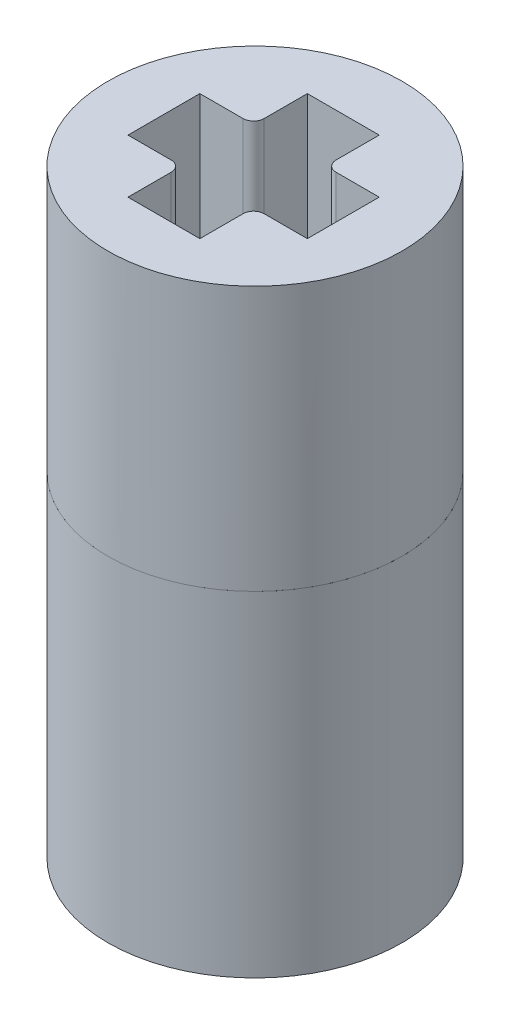
ISO-10303-21;
HEADER;
FILE_DESCRIPTION(('STEP AP214'),'2;1');
FILE_NAME('part.step','',(''),(''),'','','');
FILE_SCHEMA(('AUTOMOTIVE_DESIGN { 1 0 10303 214 1 1 1 1 }'));
ENDSEC;
DATA;
#1=APPLICATION_CONTEXT('core data for automotive mechanical design processes');
#2=APPLICATION_PROTOCOL_DEFINITION('international standard','automotive_design',2000,#1);
#3=PRODUCT_CONTEXT('',#1,'mechanical');
#4=PRODUCT('Part','Part','',(#3));
#5=PRODUCT_RELATED_PRODUCT_CATEGORY('part','',(#4));
#6=PRODUCT_DEFINITION_FORMATION('','',#4);
#7=PRODUCT_DEFINITION_CONTEXT('part definition',#1,'design');
#8=PRODUCT_DEFINITION('design','',#6,#7);
#9=PRODUCT_DEFINITION_SHAPE('','',#8);
#10=(LENGTH_UNIT() NAMED_UNIT(*) SI_UNIT(.MILLI.,.METRE.));
#11=(NAMED_UNIT(*) PLANE_ANGLE_UNIT() SI_UNIT($,.RADIAN.));
#12=(NAMED_UNIT(*) SI_UNIT($,.STERADIAN.) SOLID_ANGLE_UNIT());
#13=UNCERTAINTY_MEASURE_WITH_UNIT(LENGTH_MEASURE(1.E-05),#10,'distance_accuracy_value','');
#14=(GEOMETRIC_REPRESENTATION_CONTEXT(3) GLOBAL_UNCERTAINTY_ASSIGNED_CONTEXT((#13)) GLOBAL_UNIT_ASSIGNED_CONTEXT((#10,
#11,#12)) REPRESENTATION_CONTEXT('',''));
#15=CARTESIAN_POINT('',(0.,0.,0.));
#16=DIRECTION('',(0.,0.,1.));
#17=DIRECTION('',(1.,0.,0.));
#18=AXIS2_PLACEMENT_3D('',#15,#16,#17);
#19=CARTESIAN_POINT('',(1.45920248715791,15.1286633600111,10.1977462085435));
#20=DIRECTION('',(0.,0.,1.));
#21=DIRECTION('',(1.,0.,0.));
#22=AXIS2_PLACEMENT_3D('',#19,#20,#21);
#23=PLANE('',#22);
#24=DIRECTION('',(0.,1.,0.));
#25=VECTOR('',#24,1.);
#26=CARTESIAN_POINT('',(2.98420248715791,7.6286633600111,10.1977462085435));
#27=LINE('',#26,#25);
#28=CARTESIAN_POINT('',(2.98420248715791,7.6286633600111,10.1977462085435));
#29=VERTEX_POINT('',#28);
#30=CARTESIAN_POINT('',(2.98420248715791,15.1286633600111,10.1977462085435));
#31=VERTEX_POINT('',#30);
#32=EDGE_CURVE('P0_E36',#29,#31,#27,.T.);
#33=ORIENTED_EDGE('',*,*,#32,.F.);
#34=DIRECTION('',(-1.,0.,0.));
#35=VECTOR('',#34,1.);
#36=CARTESIAN_POINT('',(1.45920248715791,7.6286633600111,10.1977462085435));
#37=LINE('',#36,#35);
#38=CARTESIAN_POINT('',(1.75920248715791,7.6286633600111,10.1977462085435));
#39=VERTEX_POINT('',#38);
#40=EDGE_CURVE('P0_E139',#29,#39,#37,.T.);
#41=ORIENTED_EDGE('',*,*,#40,.T.);
#42=DIRECTION('',(0.,-1.,0.));
#43=VECTOR('',#42,1.);
#44=CARTESIAN_POINT('',(1.75920248715791,15.1286633600111,10.1977462085435));
#45=LINE('',#44,#43);
#46=CARTESIAN_POINT('',(1.75920248715791,15.1286633600111,10.1977462085435));
#47=VERTEX_POINT('',#46);
#48=EDGE_CURVE('P0_E238',#39,#47,#45,.F.);
#49=ORIENTED_EDGE('',*,*,#48,.T.);
#50=DIRECTION('',(-1.,0.,0.));
#51=VECTOR('',#50,1.);
#52=CARTESIAN_POINT('',(1.45920248715791,15.1286633600111,10.1977462085435));
#53=LINE('',#52,#51);
#54=EDGE_CURVE('P0_E32',#31,#47,#53,.T.);
#55=ORIENTED_EDGE('',*,*,#54,.F.);
#56=EDGE_LOOP('',(#33,#41,#49,#55));
#57=FACE_BOUND('',#56,.T.);
#58=ADVANCED_FACE('P0_F17',(#57),#23,.F.);
#59=CARTESIAN_POINT('',(3.20920248715791,15.1286633600111,8.1577462085435));
#60=DIRECTION('',(0.,0.,-1.));
#61=DIRECTION('',(-1.,0.,0.));
#62=AXIS2_PLACEMENT_3D('',#59,#60,#61);
#63=PLANE('',#62);
#64=DIRECTION('',(0.,-1.,0.));
#65=VECTOR('',#64,1.);
#66=CARTESIAN_POINT('',(2.98420248715791,7.6286633600111,8.1577462085435));
#67=LINE('',#66,#65);
#68=CARTESIAN_POINT('',(2.98420248715791,15.1286633600111,8.1577462085435));
#69=VERTEX_POINT('',#68);
#70=CARTESIAN_POINT('',(2.98420248715791,7.6286633600111,8.1577462085435));
#71=VERTEX_POINT('',#70);
#72=EDGE_CURVE('P0_E133',#69,#71,#67,.T.);
#73=ORIENTED_EDGE('',*,*,#72,.F.);
#74=DIRECTION('',(1.,0.,0.));
#75=VECTOR('',#74,1.);
#76=CARTESIAN_POINT('',(3.20920248715791,15.1286633600111,8.1577462085435));
#77=LINE('',#76,#75);
#78=CARTESIAN_POINT('',(1.75920248715791,15.1286633600111,8.15774620854351));
#79=VERTEX_POINT('',#78);
#80=EDGE_CURVE('P0_E207',#79,#69,#77,.T.);
#81=ORIENTED_EDGE('',*,*,#80,.F.);
#82=DIRECTION('',(0.,1.,0.));
#83=VECTOR('',#82,1.);
#84=CARTESIAN_POINT('',(1.75920248715791,15.1286633600111,8.15774620854351));
#85=LINE('',#84,#83);
#86=CARTESIAN_POINT('',(1.75920248715791,7.6286633600111,8.15774620854351));
#87=VERTEX_POINT('',#86);
#88=EDGE_CURVE('P0_E136',#79,#87,#85,.F.);
#89=ORIENTED_EDGE('',*,*,#88,.T.);
#90=DIRECTION('',(1.,0.,0.));
#91=VECTOR('',#90,1.);
#92=CARTESIAN_POINT('',(3.20920248715791,7.6286633600111,8.1577462085435));
#93=LINE('',#92,#91);
#94=EDGE_CURVE('P0_E128',#87,#71,#93,.T.);
#95=ORIENTED_EDGE('',*,*,#94,.T.);
#96=EDGE_LOOP('',(#73,#81,#89,#95));
#97=FACE_BOUND('',#96,.T.);
#98=ADVANCED_FACE('P0_F130',(#97),#63,.F.);
#99=CARTESIAN_POINT('',(1.45920248715791,15.1286633600111,8.15774620854351));
#100=DIRECTION('',(1.,0.,0.));
#101=DIRECTION('',(0.,0.,-1.));
#102=AXIS2_PLACEMENT_3D('',#99,#100,#101);
#103=PLANE('',#102);
#104=DIRECTION('',(0.,1.,0.));
#105=VECTOR('',#104,1.);
#106=CARTESIAN_POINT('',(1.45920248715791,15.1286633600111,6.63274620854351));
#107=LINE('',#106,#105);
#108=CARTESIAN_POINT('',(1.45920248715791,7.6286633600111,6.63274620854351));
#109=VERTEX_POINT('',#108);
#110=CARTESIAN_POINT('',(1.45920248715791,15.1286633600111,6.63274620854351));
#111=VERTEX_POINT('',#110);
#112=EDGE_CURVE('P0_E166',#109,#111,#107,.T.);
#113=ORIENTED_EDGE('',*,*,#112,.F.);
#114=DIRECTION('',(0.,0.,1.));
#115=VECTOR('',#114,1.);
#116=CARTESIAN_POINT('',(1.45920248715791,7.6286633600111,8.15774620854351));
#117=LINE('',#116,#115);
#118=CARTESIAN_POINT('',(1.45920248715791,7.6286633600111,7.8577462085435));
#119=VERTEX_POINT('',#118);
#120=EDGE_CURVE('P0_E140',#109,#119,#117,.T.);
#121=ORIENTED_EDGE('',*,*,#120,.T.);
#122=DIRECTION('',(0.,1.,0.));
#123=VECTOR('',#122,1.);
#124=CARTESIAN_POINT('',(1.45920248715791,15.1286633600111,7.8577462085435));
#125=LINE('',#124,#123);
#126=CARTESIAN_POINT('',(1.45920248715791,15.1286633600111,7.8577462085435));
#127=VERTEX_POINT('',#126);
#128=EDGE_CURVE('P0_E227',#119,#127,#125,.T.);
#129=ORIENTED_EDGE('',*,*,#128,.T.);
#130=DIRECTION('',(0.,0.,1.));
#131=VECTOR('',#130,1.);
#132=CARTESIAN_POINT('',(1.45920248715791,15.1286633600111,8.15774620854351));
#133=LINE('',#132,#131);
#134=EDGE_CURVE('P0_E205',#111,#127,#133,.T.);
#135=ORIENTED_EDGE('',*,*,#134,.F.);
#136=EDGE_LOOP('',(#113,#121,#129,#135));
#137=FACE_BOUND('',#136,.T.);
#138=ADVANCED_FACE('P0_F284',(#137),#103,.F.);
#139=CARTESIAN_POINT('',(-0.580797512842091,15.1286633600111,6.40774620854351));
#140=DIRECTION('',(-1.,0.,0.));
#141=DIRECTION('',(0.,0.,1.));
#142=AXIS2_PLACEMENT_3D('',#139,#140,#141);
#143=PLANE('',#142);
#144=DIRECTION('',(0.,-1.,0.));
#145=VECTOR('',#144,1.);
#146=CARTESIAN_POINT('',(-0.580797512842091,15.1286633600111,6.63274620854351));
#147=LINE('',#146,#145);
#148=CARTESIAN_POINT('',(-0.580797512842091,15.1286633600111,6.63274620854351));
#149=VERTEX_POINT('',#148);
#150=CARTESIAN_POINT('',(-0.580797512842091,7.6286633600111,6.63274620854351));
#151=VERTEX_POINT('',#150);
#152=EDGE_CURVE('P0_E172',#149,#151,#147,.T.);
#153=ORIENTED_EDGE('',*,*,#152,.F.);
#154=DIRECTION('',(0.,0.,-1.));
#155=VECTOR('',#154,1.);
#156=CARTESIAN_POINT('',(-0.580797512842091,15.1286633600111,6.40774620854351));
#157=LINE('',#156,#155);
#158=CARTESIAN_POINT('',(-0.580797512842091,15.1286633600111,7.8577462085435));
#159=VERTEX_POINT('',#158);
#160=EDGE_CURVE('P0_E202',#159,#149,#157,.T.);
#161=ORIENTED_EDGE('',*,*,#160,.F.);
#162=DIRECTION('',(0.,-1.,0.));
#163=VECTOR('',#162,1.);
#164=CARTESIAN_POINT('',(-0.580797512842091,15.1286633600111,7.8577462085435));
#165=LINE('',#164,#163);
#166=CARTESIAN_POINT('',(-0.580797512842091,7.6286633600111,7.8577462085435));
#167=VERTEX_POINT('',#166);
#168=EDGE_CURVE('P0_E256',#159,#167,#165,.T.);
#169=ORIENTED_EDGE('',*,*,#168,.T.);
#170=DIRECTION('',(0.,0.,-1.));
#171=VECTOR('',#170,1.);
#172=CARTESIAN_POINT('',(-0.580797512842091,7.6286633600111,6.40774620854351));
#173=LINE('',#172,#171);
#174=EDGE_CURVE('P0_E219',#167,#151,#173,.T.);
#175=ORIENTED_EDGE('',*,*,#174,.T.);
#176=EDGE_LOOP('',(#153,#161,#169,#175));
#177=FACE_BOUND('',#176,.T.);
#178=ADVANCED_FACE('P0_F273',(#177),#143,.F.);
#179=CARTESIAN_POINT('',(-0.580797512842091,15.1286633600111,8.15774620854351));
#180=DIRECTION('',(0.,0.,-1.));
#181=DIRECTION('',(-1.,0.,0.));
#182=AXIS2_PLACEMENT_3D('',#179,#180,#181);
#183=PLANE('',#182);
#184=DIRECTION('',(0.,1.,0.));
#185=VECTOR('',#184,1.);
#186=CARTESIAN_POINT('',(-2.10579751284209,15.1286633600111,8.1577462085435));
#187=LINE('',#186,#185);
#188=CARTESIAN_POINT('',(-2.10579751284209,7.6286633600111,8.1577462085435));
#189=VERTEX_POINT('',#188);
#190=CARTESIAN_POINT('',(-2.10579751284209,15.1286633600111,8.1577462085435));
#191=VERTEX_POINT('',#190);
#192=EDGE_CURVE('P0_E178',#189,#191,#187,.T.);
#193=ORIENTED_EDGE('',*,*,#192,.F.);
#194=DIRECTION('',(1.,0.,0.));
#195=VECTOR('',#194,1.);
#196=CARTESIAN_POINT('',(-0.580797512842091,7.6286633600111,8.15774620854351));
#197=LINE('',#196,#195);
#198=CARTESIAN_POINT('',(-0.880797512842093,7.6286633600111,8.15774620854351));
#199=VERTEX_POINT('',#198);
#200=EDGE_CURVE('P0_E217',#189,#199,#197,.T.);
#201=ORIENTED_EDGE('',*,*,#200,.T.);
#202=DIRECTION('',(0.,-1.,0.));
#203=VECTOR('',#202,1.);
#204=CARTESIAN_POINT('',(-0.880797512842091,15.1286633600111,8.15774620854351));
#205=LINE('',#204,#203);
#206=CARTESIAN_POINT('',(-0.880797512842093,15.1286633600111,8.15774620854351));
#207=VERTEX_POINT('',#206);
#208=EDGE_CURVE('P0_E259',#199,#207,#205,.F.);
#209=ORIENTED_EDGE('',*,*,#208,.T.);
#210=DIRECTION('',(1.,0.,0.));
#211=VECTOR('',#210,1.);
#212=CARTESIAN_POINT('',(-0.580797512842091,15.1286633600111,8.15774620854351));
#213=LINE('',#212,#211);
#214=EDGE_CURVE('P0_E200',#191,#207,#213,.T.);
#215=ORIENTED_EDGE('',*,*,#214,.F.);
#216=EDGE_LOOP('',(#193,#201,#209,#215));
#217=FACE_BOUND('',#216,.T.);
#218=ADVANCED_FACE('P0_F292',(#217),#183,.F.);
#219=CARTESIAN_POINT('',(-2.33079751284209,15.1286633600111,10.1977462085435));
#220=DIRECTION('',(0.,0.,1.));
#221=DIRECTION('',(1.,0.,0.));
#222=AXIS2_PLACEMENT_3D('',#219,#220,#221);
#223=PLANE('',#222);
#224=DIRECTION('',(0.,-1.,0.));
#225=VECTOR('',#224,1.);
#226=CARTESIAN_POINT('',(-2.10579751284209,15.1286633600111,10.1977462085435));
#227=LINE('',#226,#225);
#228=CARTESIAN_POINT('',(-2.10579751284209,15.1286633600111,10.1977462085435));
#229=VERTEX_POINT('',#228);
#230=CARTESIAN_POINT('',(-2.10579751284209,7.6286633600111,10.1977462085435));
#231=VERTEX_POINT('',#230);
#232=EDGE_CURVE('P0_E184',#229,#231,#227,.T.);
#233=ORIENTED_EDGE('',*,*,#232,.F.);
#234=DIRECTION('',(-1.,0.,0.));
#235=VECTOR('',#234,1.);
#236=CARTESIAN_POINT('',(-2.33079751284209,15.1286633600111,10.1977462085435));
#237=LINE('',#236,#235);
#238=CARTESIAN_POINT('',(-0.880797512842093,15.1286633600111,10.1977462085435));
#239=VERTEX_POINT('',#238);
#240=EDGE_CURVE('P0_E196',#239,#229,#237,.T.);
#241=ORIENTED_EDGE('',*,*,#240,.F.);
#242=DIRECTION('',(0.,-1.,0.));
#243=VECTOR('',#242,1.);
#244=CARTESIAN_POINT('',(-0.880797512842093,15.1286633600111,10.1977462085435));
#245=LINE('',#244,#243);
#246=CARTESIAN_POINT('',(-0.880797512842093,7.6286633600111,10.1977462085435));
#247=VERTEX_POINT('',#246);
#248=EDGE_CURVE('P0_E245',#239,#247,#245,.T.);
#249=ORIENTED_EDGE('',*,*,#248,.T.);
#250=DIRECTION('',(-1.,0.,0.));
#251=VECTOR('',#250,1.);
#252=CARTESIAN_POINT('',(-2.33079751284209,7.6286633600111,10.1977462085435));
#253=LINE('',#252,#251);
#254=EDGE_CURVE('P0_E215',#247,#231,#253,.T.);
#255=ORIENTED_EDGE('',*,*,#254,.T.);
#256=EDGE_LOOP('',(#233,#241,#249,#255));
#257=FACE_BOUND('',#256,.T.);
#258=ADVANCED_FACE('P0_F390',(#257),#223,.F.);
#259=CARTESIAN_POINT('',(-0.880797512842091,15.1286633600111,7.8577462085435));
#260=DIRECTION('',(0.,-1.,0.));
#261=DIRECTION('',(0.,0.,-1.));
#262=AXIS2_PLACEMENT_3D('',#259,#260,#261);
#263=CYLINDRICAL_SURFACE('',#262,0.3);
#264=ORIENTED_EDGE('',*,*,#168,.F.);
#265=CARTESIAN_POINT('',(-0.880797512842091,15.1286633600111,7.8577462085435));
#266=DIRECTION('',(0.,1.,0.));
#267=DIRECTION('',(0.,0.,1.));
#268=AXIS2_PLACEMENT_3D('',#265,#266,#267);
#269=CIRCLE('',#268,0.3);
#270=EDGE_CURVE('P0_E25',#207,#159,#269,.T.);
#271=ORIENTED_EDGE('',*,*,#270,.F.);
#272=ORIENTED_EDGE('',*,*,#208,.F.);
#273=CARTESIAN_POINT('',(-0.880797512842091,7.6286633600111,7.8577462085435));
#274=DIRECTION('',(0.,1.,0.));
#275=DIRECTION('',(0.,0.,1.));
#276=AXIS2_PLACEMENT_3D('',#273,#274,#275);
#277=CIRCLE('',#276,0.3);
#278=EDGE_CURVE('P0_E11',#167,#199,#277,.F.);
#279=ORIENTED_EDGE('',*,*,#278,.F.);
#280=EDGE_LOOP('',(#264,#271,#272,#279));
#281=FACE_BOUND('',#280,.T.);
#282=ADVANCED_FACE('P0_F19',(#281),#263,.T.);
#283=CARTESIAN_POINT('',(-0.880797512842093,15.1286633600111,10.4977462085435));
#284=DIRECTION('',(0.,-1.,0.));
#285=DIRECTION('',(0.,0.,-1.));
#286=AXIS2_PLACEMENT_3D('',#283,#284,#285);
#287=CYLINDRICAL_SURFACE('',#286,0.3);
#288=ORIENTED_EDGE('',*,*,#248,.F.);
#289=CARTESIAN_POINT('',(-0.880797512842093,15.1286633600111,10.4977462085435));
#290=DIRECTION('',(0.,1.,0.));
#291=DIRECTION('',(0.,0.,1.));
#292=AXIS2_PLACEMENT_3D('',#289,#290,#291);
#293=CIRCLE('',#292,0.3);
#294=CARTESIAN_POINT('',(-0.580797512842093,15.1286633600111,10.4977462085435));
#295=VERTEX_POINT('',#294);
#296=EDGE_CURVE('P0_E251',#295,#239,#293,.T.);
#297=ORIENTED_EDGE('',*,*,#296,.F.);
#298=DIRECTION('',(0.,-1.,0.));
#299=VECTOR('',#298,1.);
#300=CARTESIAN_POINT('',(-0.580797512842093,15.1286633600111,10.4977462085435));
#301=LINE('',#300,#299);
#302=CARTESIAN_POINT('',(-0.580797512842093,7.6286633600111,10.4977462085435));
#303=VERTEX_POINT('',#302);
#304=EDGE_CURVE('P0_E248',#303,#295,#301,.F.);
#305=ORIENTED_EDGE('',*,*,#304,.F.);
#306=CARTESIAN_POINT('',(-0.880797512842093,7.6286633600111,10.4977462085435));
#307=DIRECTION('',(0.,1.,0.));
#308=DIRECTION('',(0.,0.,1.));
#309=AXIS2_PLACEMENT_3D('',#306,#307,#308);
#310=CIRCLE('',#309,0.3);
#311=EDGE_CURVE('P0_E253',#247,#303,#310,.F.);
#312=ORIENTED_EDGE('',*,*,#311,.F.);
#313=EDGE_LOOP('',(#288,#297,#305,#312));
#314=FACE_BOUND('',#313,.T.);
#315=ADVANCED_FACE('P0_F376',(#314),#287,.T.);
#316=CARTESIAN_POINT('',(1.75920248715791,15.1286633600111,10.4977462085435));
#317=DIRECTION('',(0.,-1.,0.));
#318=DIRECTION('',(0.,0.,-1.));
#319=AXIS2_PLACEMENT_3D('',#316,#317,#318);
#320=CYLINDRICAL_SURFACE('',#319,0.3);
#321=DIRECTION('',(0.,-1.,0.));
#322=VECTOR('',#321,1.);
#323=CARTESIAN_POINT('',(1.45920248715791,15.1286633600111,10.4977462085435));
#324=LINE('',#323,#322);
#325=CARTESIAN_POINT('',(1.45920248715791,15.1286633600111,10.4977462085435));
#326=VERTEX_POINT('',#325);
#327=CARTESIAN_POINT('',(1.45920248715791,7.6286633600111,10.4977462085435));
#328=VERTEX_POINT('',#327);
#329=EDGE_CURVE('P0_E235',#326,#328,#324,.T.);
#330=ORIENTED_EDGE('',*,*,#329,.F.);
#331=CARTESIAN_POINT('',(1.75920248715791,15.1286633600111,10.4977462085435));
#332=DIRECTION('',(0.,1.,0.));
#333=DIRECTION('',(0.,0.,1.));
#334=AXIS2_PLACEMENT_3D('',#331,#332,#333);
#335=CIRCLE('',#334,0.3);
#336=EDGE_CURVE('P0_E240',#47,#326,#335,.T.);
#337=ORIENTED_EDGE('',*,*,#336,.F.);
#338=ORIENTED_EDGE('',*,*,#48,.F.);
#339=CARTESIAN_POINT('',(1.75920248715791,7.6286633600111,10.4977462085435));
#340=DIRECTION('',(0.,1.,0.));
#341=DIRECTION('',(0.,0.,1.));
#342=AXIS2_PLACEMENT_3D('',#339,#340,#341);
#343=CIRCLE('',#342,0.3);
#344=EDGE_CURVE('P0_E243',#328,#39,#343,.F.);
#345=ORIENTED_EDGE('',*,*,#344,.F.);
#346=EDGE_LOOP('',(#330,#337,#338,#345));
#347=FACE_BOUND('',#346,.T.);
#348=ADVANCED_FACE('P0_F369',(#347),#320,.T.);
#349=CARTESIAN_POINT('',(1.75920248715791,15.1286633600111,7.8577462085435));
#350=DIRECTION('',(0.,1.,0.));
#351=DIRECTION('',(0.,0.,1.));
#352=AXIS2_PLACEMENT_3D('',#349,#350,#351);
#353=CYLINDRICAL_SURFACE('',#352,0.3);
#354=ORIENTED_EDGE('',*,*,#128,.F.);
#355=CARTESIAN_POINT('',(1.75920248715791,7.6286633600111,7.8577462085435));
#356=DIRECTION('',(0.,1.,0.));
#357=DIRECTION('',(0.,0.,1.));
#358=AXIS2_PLACEMENT_3D('',#355,#356,#357);
#359=CIRCLE('',#358,0.3);
#360=EDGE_CURVE('P0_E231',#87,#119,#359,.F.);
#361=ORIENTED_EDGE('',*,*,#360,.F.);
#362=ORIENTED_EDGE('',*,*,#88,.F.);
#363=CARTESIAN_POINT('',(1.75920248715791,15.1286633600111,7.8577462085435));
#364=DIRECTION('',(0.,1.,0.));
#365=DIRECTION('',(0.,0.,1.));
#366=AXIS2_PLACEMENT_3D('',#363,#364,#365);
#367=CIRCLE('',#366,0.3);
#368=EDGE_CURVE('P0_E233',#127,#79,#367,.T.);
#369=ORIENTED_EDGE('',*,*,#368,.F.);
#370=EDGE_LOOP('',(#354,#361,#362,#369));
#371=FACE_BOUND('',#370,.T.);
#372=ADVANCED_FACE('P0_F283',(#371),#353,.T.);
#373=CARTESIAN_POINT('',(12.9784928985452,15.1286633600111,2.26811984953277));
#374=DIRECTION('',(0.,1.,0.));
#375=DIRECTION('',(0.,0.,1.));
#376=AXIS2_PLACEMENT_3D('',#373,#374,#375);
#377=PLANE('',#376);
#378=DIRECTION('',(0.,0.,-1.));
#379=VECTOR('',#378,1.);
#380=CARTESIAN_POINT('',(2.98420248715791,15.1286633600111,8.1577462085435));
#381=LINE('',#380,#379);
#382=EDGE_CURVE('P0_E152',#31,#69,#381,.T.);
#383=ORIENTED_EDGE('',*,*,#382,.F.);
#384=ORIENTED_EDGE('',*,*,#54,.T.);
#385=ORIENTED_EDGE('',*,*,#336,.T.);
#386=DIRECTION('',(0.,0.,1.));
#387=VECTOR('',#386,1.);
#388=CARTESIAN_POINT('',(1.45920248715791,15.1286633600111,11.9477462085435));
#389=LINE('',#388,#387);
#390=CARTESIAN_POINT('',(1.45920248715791,15.1286633600111,11.7227462085435));
#391=VERTEX_POINT('',#390);
#392=EDGE_CURVE('P0_E210',#326,#391,#389,.T.);
#393=ORIENTED_EDGE('',*,*,#392,.T.);
#394=DIRECTION('',(1.,0.,0.));
#395=VECTOR('',#394,1.);
#396=CARTESIAN_POINT('',(-0.580797512842093,15.1286633600111,11.7227462085435));
#397=LINE('',#396,#395);
#398=CARTESIAN_POINT('',(-0.580797512842093,15.1286633600111,11.7227462085435));
#399=VERTEX_POINT('',#398);
#400=EDGE_CURVE('P0_E160',#399,#391,#397,.T.);
#401=ORIENTED_EDGE('',*,*,#400,.F.);
#402=DIRECTION('',(0.,0.,-1.));
#403=VECTOR('',#402,1.);
#404=CARTESIAN_POINT('',(-0.580797512842093,15.1286633600111,10.1977462085435));
#405=LINE('',#404,#403);
#406=EDGE_CURVE('P0_E194',#399,#295,#405,.T.);
#407=ORIENTED_EDGE('',*,*,#406,.T.);
#408=ORIENTED_EDGE('',*,*,#296,.T.);
#409=ORIENTED_EDGE('',*,*,#240,.T.);
#410=DIRECTION('',(0.,0.,1.));
#411=VECTOR('',#410,1.);
#412=CARTESIAN_POINT('',(-2.10579751284209,15.1286633600111,8.1577462085435));
#413=LINE('',#412,#411);
#414=EDGE_CURVE('P0_E181',#191,#229,#413,.T.);
#415=ORIENTED_EDGE('',*,*,#414,.F.);
#416=ORIENTED_EDGE('',*,*,#214,.T.);
#417=ORIENTED_EDGE('',*,*,#270,.T.);
#418=ORIENTED_EDGE('',*,*,#160,.T.);
#419=DIRECTION('',(-1.,0.,0.));
#420=VECTOR('',#419,1.);
#421=CARTESIAN_POINT('',(1.45920248715791,15.1286633600111,6.63274620854351));
#422=LINE('',#421,#420);
#423=EDGE_CURVE('P0_E169',#111,#149,#422,.T.);
#424=ORIENTED_EDGE('',*,*,#423,.F.);
#425=ORIENTED_EDGE('',*,*,#134,.T.);
#426=ORIENTED_EDGE('',*,*,#368,.T.);
#427=ORIENTED_EDGE('',*,*,#80,.T.);
#428=EDGE_LOOP('',(#383,#384,#385,#393,#401,#407,#408,#409,#415,#416,#417,#418,#424,#425,#426,#427));
#429=FACE_BOUND('',#428,.T.);
#430=CARTESIAN_POINT('',(0.459202487157908,15.1286633600111,9.15774620854351));
#431=DIRECTION('',(0.,-1.,0.));
#432=DIRECTION('',(0.,0.,-1.));
#433=AXIS2_PLACEMENT_3D('',#430,#431,#432);
#434=CIRCLE('',#433,4.175);
#435=CARTESIAN_POINT('',(0.459202487157908,15.1286633600111,4.98274620854351));
#436=VERTEX_POINT('',#435);
#437=EDGE_CURVE('P0_E190',#436,#436,#434,.T.);
#438=ORIENTED_EDGE('',*,*,#437,.F.);
#439=EDGE_LOOP('',(#438));
#440=FACE_BOUND('',#439,.T.);
#441=ADVANCED_FACE('P0_F265',(#429,#440),#377,.T.);
#442=CARTESIAN_POINT('',(0.459202487157908,24.6286633600111,9.15774620854351));
#443=DIRECTION('',(0.,-1.,0.));
#444=DIRECTION('',(0.,0.,-1.));
#445=AXIS2_PLACEMENT_3D('',#442,#443,#444);
#446=CYLINDRICAL_SURFACE('',#445,4.175);
#447=ORIENTED_EDGE('',*,*,#437,.T.);
#448=EDGE_LOOP('',(#447));
#449=FACE_BOUND('',#448,.T.);
#450=CARTESIAN_POINT('',(0.459202487157908,7.6286633600111,9.15774620854351));
#451=DIRECTION('',(0.,1.,0.));
#452=DIRECTION('',(0.,0.,1.));
#453=AXIS2_PLACEMENT_3D('',#450,#451,#452);
#454=CIRCLE('',#453,4.175);
#455=CARTESIAN_POINT('',(0.459202487157908,7.6286633600111,13.3327462085435));
#456=VERTEX_POINT('',#455);
#457=EDGE_CURVE('P0_E213',#456,#456,#454,.T.);
#458=ORIENTED_EDGE('',*,*,#457,.T.);
#459=EDGE_LOOP('',(#458));
#460=FACE_BOUND('',#459,.T.);
#461=ADVANCED_FACE('P0_F349',(#449,#460),#446,.T.);
#462=CARTESIAN_POINT('',(0.459202487157908,7.6286633600111,9.15774620854351));
#463=DIRECTION('',(0.,1.,0.));
#464=DIRECTION('',(0.,0.,1.));
#465=AXIS2_PLACEMENT_3D('',#462,#463,#464);
#466=PLANE('',#465);
#467=ORIENTED_EDGE('',*,*,#40,.F.);
#468=DIRECTION('',(0.,0.,1.));
#469=VECTOR('',#468,1.);
#470=CARTESIAN_POINT('',(2.98420248715791,7.6286633600111,8.1577462085435));
#471=LINE('',#470,#469);
#472=EDGE_CURVE('P0_E143',#71,#29,#471,.T.);
#473=ORIENTED_EDGE('',*,*,#472,.F.);
#474=ORIENTED_EDGE('',*,*,#94,.F.);
#475=ORIENTED_EDGE('',*,*,#360,.T.);
#476=ORIENTED_EDGE('',*,*,#120,.F.);
#477=DIRECTION('',(1.,0.,0.));
#478=VECTOR('',#477,1.);
#479=CARTESIAN_POINT('',(1.45920248715791,7.6286633600111,6.63274620854351));
#480=LINE('',#479,#478);
#481=EDGE_CURVE('P0_E175',#151,#109,#480,.T.);
#482=ORIENTED_EDGE('',*,*,#481,.F.);
#483=ORIENTED_EDGE('',*,*,#174,.F.);
#484=ORIENTED_EDGE('',*,*,#278,.T.);
#485=ORIENTED_EDGE('',*,*,#200,.F.);
#486=DIRECTION('',(0.,0.,-1.));
#487=VECTOR('',#486,1.);
#488=CARTESIAN_POINT('',(-2.10579751284209,7.6286633600111,8.1577462085435));
#489=LINE('',#488,#487);
#490=EDGE_CURVE('P0_E187',#231,#189,#489,.T.);
#491=ORIENTED_EDGE('',*,*,#490,.F.);
#492=ORIENTED_EDGE('',*,*,#254,.F.);
#493=ORIENTED_EDGE('',*,*,#311,.T.);
#494=DIRECTION('',(0.,0.,-1.));
#495=VECTOR('',#494,1.);
#496=CARTESIAN_POINT('',(-0.580797512842093,7.6286633600111,10.1977462085435));
#497=LINE('',#496,#495);
#498=CARTESIAN_POINT('',(-0.580797512842093,7.6286633600111,11.7227462085435));
#499=VERTEX_POINT('',#498);
#500=EDGE_CURVE('P0_E193',#499,#303,#497,.T.);
#501=ORIENTED_EDGE('',*,*,#500,.F.);
#502=DIRECTION('',(-1.,0.,0.));
#503=VECTOR('',#502,1.);
#504=CARTESIAN_POINT('',(-0.580797512842093,7.6286633600111,11.7227462085435));
#505=LINE('',#504,#503);
#506=CARTESIAN_POINT('',(1.45920248715791,7.6286633600111,11.7227462085435));
#507=VERTEX_POINT('',#506);
#508=EDGE_CURVE('P0_E164',#507,#499,#505,.T.);
#509=ORIENTED_EDGE('',*,*,#508,.F.);
#510=DIRECTION('',(0.,0.,1.));
#511=VECTOR('',#510,1.);
#512=CARTESIAN_POINT('',(1.45920248715791,7.6286633600111,11.9477462085435));
#513=LINE('',#512,#511);
#514=EDGE_CURVE('P0_E197',#328,#507,#513,.T.);
#515=ORIENTED_EDGE('',*,*,#514,.F.);
#516=ORIENTED_EDGE('',*,*,#344,.T.);
#517=EDGE_LOOP('',(#467,#473,#474,#475,#476,#482,#483,#484,#485,#491,#492,#493,#501,#509,#515,#516));
#518=FACE_BOUND('',#517,.T.);
#519=ORIENTED_EDGE('',*,*,#457,.F.);
#520=EDGE_LOOP('',(#519));
#521=FACE_BOUND('',#520,.T.);
#522=ADVANCED_FACE('P0_F144',(#518,#521),#466,.F.);
#523=CARTESIAN_POINT('',(-0.580797512842093,15.1286633600111,10.1977462085435));
#524=DIRECTION('',(-1.,0.,0.));
#525=DIRECTION('',(0.,0.,1.));
#526=AXIS2_PLACEMENT_3D('',#523,#524,#525);
#527=PLANE('',#526);
#528=ORIENTED_EDGE('',*,*,#406,.F.);
#529=DIRECTION('',(0.,1.,0.));
#530=VECTOR('',#529,1.);
#531=CARTESIAN_POINT('',(-0.580797512842093,7.6286633600111,11.7227462085435));
#532=LINE('',#531,#530);
#533=EDGE_CURVE('P0_E157',#499,#399,#532,.T.);
#534=ORIENTED_EDGE('',*,*,#533,.F.);
#535=ORIENTED_EDGE('',*,*,#500,.T.);
#536=ORIENTED_EDGE('',*,*,#304,.T.);
#537=EDGE_LOOP('',(#528,#534,#535,#536));
#538=FACE_BOUND('',#537,.T.);
#539=ADVANCED_FACE('P0_F304',(#538),#527,.F.);
#540=CARTESIAN_POINT('',(1.45920248715791,15.1286633600111,11.9477462085435));
#541=DIRECTION('',(1.,0.,0.));
#542=DIRECTION('',(0.,0.,-1.));
#543=AXIS2_PLACEMENT_3D('',#540,#541,#542);
#544=PLANE('',#543);
#545=ORIENTED_EDGE('',*,*,#514,.T.);
#546=DIRECTION('',(0.,-1.,0.));
#547=VECTOR('',#546,1.);
#548=CARTESIAN_POINT('',(1.45920248715791,7.6286633600111,11.7227462085435));
#549=LINE('',#548,#547);
#550=EDGE_CURVE('P0_E162',#391,#507,#549,.T.);
#551=ORIENTED_EDGE('',*,*,#550,.F.);
#552=ORIENTED_EDGE('',*,*,#392,.F.);
#553=ORIENTED_EDGE('',*,*,#329,.T.);
#554=EDGE_LOOP('',(#545,#551,#552,#553));
#555=FACE_BOUND('',#554,.T.);
#556=ADVANCED_FACE('P0_F300',(#555),#544,.F.);
#557=CARTESIAN_POINT('',(-2.10579751284209,7.6286633600111,2.26811984953277));
#558=DIRECTION('',(-1.,0.,0.));
#559=DIRECTION('',(0.,0.,1.));
#560=AXIS2_PLACEMENT_3D('',#557,#558,#559);
#561=PLANE('',#560);
#562=ORIENTED_EDGE('',*,*,#192,.T.);
#563=ORIENTED_EDGE('',*,*,#414,.T.);
#564=ORIENTED_EDGE('',*,*,#232,.T.);
#565=ORIENTED_EDGE('',*,*,#490,.T.);
#566=EDGE_LOOP('',(#562,#563,#564,#565));
#567=FACE_BOUND('',#566,.T.);
#568=ADVANCED_FACE('P0_F303',(#567),#561,.F.);
#569=CARTESIAN_POINT('',(12.9784928985452,7.6286633600111,6.63274620854351));
#570=DIRECTION('',(0.,0.,-1.));
#571=DIRECTION('',(-1.,0.,0.));
#572=AXIS2_PLACEMENT_3D('',#569,#570,#571);
#573=PLANE('',#572);
#574=ORIENTED_EDGE('',*,*,#112,.T.);
#575=ORIENTED_EDGE('',*,*,#423,.T.);
#576=ORIENTED_EDGE('',*,*,#152,.T.);
#577=ORIENTED_EDGE('',*,*,#481,.T.);
#578=EDGE_LOOP('',(#574,#575,#576,#577));
#579=FACE_BOUND('',#578,.T.);
#580=ADVANCED_FACE('P0_F278',(#579),#573,.F.);
#581=CARTESIAN_POINT('',(12.9784928985452,7.6286633600111,11.7227462085435));
#582=DIRECTION('',(0.,0.,-1.));
#583=DIRECTION('',(-1.,0.,0.));
#584=AXIS2_PLACEMENT_3D('',#581,#582,#583);
#585=PLANE('',#584);
#586=ORIENTED_EDGE('',*,*,#533,.T.);
#587=ORIENTED_EDGE('',*,*,#400,.T.);
#588=ORIENTED_EDGE('',*,*,#550,.T.);
#589=ORIENTED_EDGE('',*,*,#508,.T.);
#590=EDGE_LOOP('',(#586,#587,#588,#589));
#591=FACE_BOUND('',#590,.T.);
#592=ADVANCED_FACE('P0_F311',(#591),#585,.T.);
#593=CARTESIAN_POINT('',(2.98420248715791,7.6286633600111,2.26811984953277));
#594=DIRECTION('',(1.,0.,0.));
#595=DIRECTION('',(0.,0.,-1.));
#596=AXIS2_PLACEMENT_3D('',#593,#594,#595);
#597=PLANE('',#596);
#598=ORIENTED_EDGE('',*,*,#72,.T.);
#599=ORIENTED_EDGE('',*,*,#472,.T.);
#600=ORIENTED_EDGE('',*,*,#32,.T.);
#601=ORIENTED_EDGE('',*,*,#382,.T.);
#602=EDGE_LOOP('',(#598,#599,#600,#601));
#603=FACE_BOUND('',#602,.T.);
#604=ADVANCED_FACE('P0_F150',(#603),#597,.F.);
#605=CLOSED_SHELL('',(#58,#98,#138,#178,#218,#258,#282,#315,#348,#372,#441,#461,#522,#539,#556,
#568,#580,#592,#604));
#606=MANIFOLD_SOLID_BREP('P0_B1',#605);
#607=CARTESIAN_POINT('',(0.459202487157908,7.6286633600111,9.15774620854351));
#608=DIRECTION('',(0.,1.,0.));
#609=DIRECTION('',(0.,0.,1.));
#610=AXIS2_PLACEMENT_3D('',#607,#608,#609);
#611=PLANE('',#610);
#612=CARTESIAN_POINT('',(0.459202487157908,7.6286633600111,9.15774620854351));
#613=DIRECTION('',(0.,1.,0.));
#614=DIRECTION('',(0.,0.,1.));
#615=AXIS2_PLACEMENT_3D('',#612,#613,#614);
#616=CIRCLE('',#615,4.175);
#617=CARTESIAN_POINT('',(0.459202487157908,7.6286633600111,13.3327462085435));
#618=VERTEX_POINT('',#617);
#619=EDGE_CURVE('P1_E11',#618,#618,#616,.T.);
#620=ORIENTED_EDGE('',*,*,#619,.T.);
#621=EDGE_LOOP('',(#620));
#622=FACE_BOUND('',#621,.T.);
#623=DIRECTION('',(0.,0.,-1.));
#624=VECTOR('',#623,1.);
#625=CARTESIAN_POINT('',(-2.36579751284209,7.6286633600111,2.26811984953277));
#626=LINE('',#625,#624);
#627=CARTESIAN_POINT('',(-2.36579751284209,7.6286633600111,11.2077462085435));
#628=VERTEX_POINT('',#627);
#629=CARTESIAN_POINT('',(-2.36579751284209,7.6286633600111,7.25774620854351));
#630=VERTEX_POINT('',#629);
#631=EDGE_CURVE('P1_E93',#628,#630,#626,.T.);
#632=ORIENTED_EDGE('',*,*,#631,.T.);
#633=DIRECTION('',(1.,0.,0.));
#634=VECTOR('',#633,1.);
#635=CARTESIAN_POINT('',(12.9784928985452,7.6286633600111,7.25774620854351));
#636=LINE('',#635,#634);
#637=CARTESIAN_POINT('',(3.28420248715791,7.6286633600111,7.25774620854351));
#638=VERTEX_POINT('',#637);
#639=EDGE_CURVE('P1_E33',#630,#638,#636,.T.);
#640=ORIENTED_EDGE('',*,*,#639,.T.);
#641=DIRECTION('',(0.,0.,-1.));
#642=VECTOR('',#641,1.);
#643=CARTESIAN_POINT('',(3.28420248715791,7.6286633600111,2.26811984953277));
#644=LINE('',#643,#642);
#645=CARTESIAN_POINT('',(3.28420248715791,7.6286633600111,11.2077462085435));
#646=VERTEX_POINT('',#645);
#647=EDGE_CURVE('P1_E79',#646,#638,#644,.T.);
#648=ORIENTED_EDGE('',*,*,#647,.F.);
#649=DIRECTION('',(1.,0.,0.));
#650=VECTOR('',#649,1.);
#651=CARTESIAN_POINT('',(12.9784928985452,7.6286633600111,11.2077462085435));
#652=LINE('',#651,#650);
#653=EDGE_CURVE('P1_E84',#628,#646,#652,.T.);
#654=ORIENTED_EDGE('',*,*,#653,.F.);
#655=EDGE_LOOP('',(#632,#640,#648,#654));
#656=FACE_BOUND('',#655,.T.);
#657=ADVANCED_FACE('P1_F17',(#622,#656),#611,.T.);
#658=CARTESIAN_POINT('',(0.459202487157908,-1.8713366399889,9.15774620854351));
#659=DIRECTION('',(0.,1.,0.));
#660=DIRECTION('',(0.,0.,1.));
#661=AXIS2_PLACEMENT_3D('',#658,#659,#660);
#662=PLANE('',#661);
#663=CARTESIAN_POINT('',(0.459202487157908,-1.8713366399889,9.15774620854351));
#664=DIRECTION('',(0.,1.,0.));
#665=DIRECTION('',(0.,0.,1.));
#666=AXIS2_PLACEMENT_3D('',#663,#664,#665);
#667=CIRCLE('',#666,4.175);
#668=CARTESIAN_POINT('',(0.459202487157908,-1.8713366399889,13.3327462085435));
#669=VERTEX_POINT('',#668);
#670=EDGE_CURVE('P1_E21',#669,#669,#667,.T.);
#671=ORIENTED_EDGE('',*,*,#670,.F.);
#672=EDGE_LOOP('',(#671));
#673=FACE_BOUND('',#672,.T.);
#674=DIRECTION('',(1.,0.,0.));
#675=VECTOR('',#674,1.);
#676=CARTESIAN_POINT('',(12.9784928985452,-1.8713366399889,7.25774620854351));
#677=LINE('',#676,#675);
#678=CARTESIAN_POINT('',(-2.36579751284209,-1.8713366399889,7.25774620854351));
#679=VERTEX_POINT('',#678);
#680=CARTESIAN_POINT('',(3.28420248715791,-1.8713366399889,7.25774620854351));
#681=VERTEX_POINT('',#680);
#682=EDGE_CURVE('P1_E68',#679,#681,#677,.T.);
#683=ORIENTED_EDGE('',*,*,#682,.F.);
#684=DIRECTION('',(0.,0.,-1.));
#685=VECTOR('',#684,1.);
#686=CARTESIAN_POINT('',(-2.36579751284209,-1.8713366399889,2.26811984953277));
#687=LINE('',#686,#685);
#688=CARTESIAN_POINT('',(-2.36579751284209,-1.8713366399889,11.2077462085435));
#689=VERTEX_POINT('',#688);
#690=EDGE_CURVE('P1_E59',#689,#679,#687,.T.);
#691=ORIENTED_EDGE('',*,*,#690,.F.);
#692=DIRECTION('',(1.,0.,0.));
#693=VECTOR('',#692,1.);
#694=CARTESIAN_POINT('',(12.9784928985452,-1.8713366399889,11.2077462085435));
#695=LINE('',#694,#693);
#696=CARTESIAN_POINT('',(3.28420248715791,-1.8713366399889,11.2077462085435));
#697=VERTEX_POINT('',#696);
#698=EDGE_CURVE('P1_E41',#689,#697,#695,.T.);
#699=ORIENTED_EDGE('',*,*,#698,.T.);
#700=DIRECTION('',(0.,0.,-1.));
#701=VECTOR('',#700,1.);
#702=CARTESIAN_POINT('',(3.28420248715791,-1.8713366399889,2.26811984953277));
#703=LINE('',#702,#701);
#704=EDGE_CURVE('P1_E73',#697,#681,#703,.T.);
#705=ORIENTED_EDGE('',*,*,#704,.T.);
#706=EDGE_LOOP('',(#683,#691,#699,#705));
#707=FACE_BOUND('',#706,.T.);
#708=ADVANCED_FACE('P1_F76',(#673,#707),#662,.F.);
#709=CARTESIAN_POINT('',(0.459202487157908,7.6286633600111,9.15774620854351));
#710=DIRECTION('',(0.,-1.,0.));
#711=DIRECTION('',(0.,0.,-1.));
#712=AXIS2_PLACEMENT_3D('',#709,#710,#711);
#713=CYLINDRICAL_SURFACE('',#712,4.175);
#714=ORIENTED_EDGE('',*,*,#619,.F.);
#715=EDGE_LOOP('',(#714));
#716=FACE_BOUND('',#715,.T.);
#717=ORIENTED_EDGE('',*,*,#670,.T.);
#718=EDGE_LOOP('',(#717));
#719=FACE_BOUND('',#718,.T.);
#720=ADVANCED_FACE('P1_F19',(#716,#719),#713,.T.);
#721=CARTESIAN_POINT('',(12.9784928985452,-1.8713366399889,7.25774620854351));
#722=DIRECTION('',(0.,0.,1.));
#723=DIRECTION('',(1.,0.,0.));
#724=AXIS2_PLACEMENT_3D('',#721,#722,#723);
#725=PLANE('',#724);
#726=ORIENTED_EDGE('',*,*,#639,.F.);
#727=DIRECTION('',(0.,1.,0.));
#728=VECTOR('',#727,1.);
#729=CARTESIAN_POINT('',(-2.36579751284209,-1.8713366399889,7.25774620854351));
#730=LINE('',#729,#728);
#731=EDGE_CURVE('P1_E62',#679,#630,#730,.T.);
#732=ORIENTED_EDGE('',*,*,#731,.F.);
#733=ORIENTED_EDGE('',*,*,#682,.T.);
#734=DIRECTION('',(0.,1.,0.));
#735=VECTOR('',#734,1.);
#736=CARTESIAN_POINT('',(3.28420248715791,-1.8713366399889,7.25774620854351));
#737=LINE('',#736,#735);
#738=EDGE_CURVE('P1_E99',#681,#638,#737,.T.);
#739=ORIENTED_EDGE('',*,*,#738,.T.);
#740=EDGE_LOOP('',(#726,#732,#733,#739));
#741=FACE_BOUND('',#740,.T.);
#742=ADVANCED_FACE('P1_F70',(#741),#725,.T.);
#743=CARTESIAN_POINT('',(3.28420248715791,-1.8713366399889,2.26811984953277));
#744=DIRECTION('',(1.,0.,0.));
#745=DIRECTION('',(0.,0.,-1.));
#746=AXIS2_PLACEMENT_3D('',#743,#744,#745);
#747=PLANE('',#746);
#748=ORIENTED_EDGE('',*,*,#647,.T.);
#749=ORIENTED_EDGE('',*,*,#738,.F.);
#750=ORIENTED_EDGE('',*,*,#704,.F.);
#751=DIRECTION('',(0.,1.,0.));
#752=VECTOR('',#751,1.);
#753=CARTESIAN_POINT('',(3.28420248715791,-1.8713366399889,11.2077462085435));
#754=LINE('',#753,#752);
#755=EDGE_CURVE('P1_E102',#697,#646,#754,.T.);
#756=ORIENTED_EDGE('',*,*,#755,.T.);
#757=EDGE_LOOP('',(#748,#749,#750,#756));
#758=FACE_BOUND('',#757,.T.);
#759=ADVANCED_FACE('P1_F111',(#758),#747,.F.);
#760=CARTESIAN_POINT('',(12.9784928985452,-1.8713366399889,11.2077462085435));
#761=DIRECTION('',(0.,0.,1.));
#762=DIRECTION('',(1.,0.,0.));
#763=AXIS2_PLACEMENT_3D('',#760,#761,#762);
#764=PLANE('',#763);
#765=ORIENTED_EDGE('',*,*,#653,.T.);
#766=ORIENTED_EDGE('',*,*,#755,.F.);
#767=ORIENTED_EDGE('',*,*,#698,.F.);
#768=DIRECTION('',(0.,1.,0.));
#769=VECTOR('',#768,1.);
#770=CARTESIAN_POINT('',(-2.36579751284209,-1.8713366399889,11.2077462085435));
#771=LINE('',#770,#769);
#772=EDGE_CURVE('P1_E64',#689,#628,#771,.T.);
#773=ORIENTED_EDGE('',*,*,#772,.T.);
#774=EDGE_LOOP('',(#765,#766,#767,#773));
#775=FACE_BOUND('',#774,.T.);
#776=ADVANCED_FACE('P1_F106',(#775),#764,.F.);
#777=CARTESIAN_POINT('',(-2.36579751284209,-1.8713366399889,2.26811984953277));
#778=DIRECTION('',(1.,0.,0.));
#779=DIRECTION('',(0.,0.,-1.));
#780=AXIS2_PLACEMENT_3D('',#777,#778,#779);
#781=PLANE('',#780);
#782=ORIENTED_EDGE('',*,*,#631,.F.);
#783=ORIENTED_EDGE('',*,*,#772,.F.);
#784=ORIENTED_EDGE('',*,*,#690,.T.);
#785=ORIENTED_EDGE('',*,*,#731,.T.);
#786=EDGE_LOOP('',(#782,#783,#784,#785));
#787=FACE_BOUND('',#786,.T.);
#788=ADVANCED_FACE('P1_F61',(#787),#781,.T.);
#789=CLOSED_SHELL('',(#657,#708,#720,#742,#759,#776,#788));
#790=MANIFOLD_SOLID_BREP('P1_B1',#789);
#791=ADVANCED_BREP_SHAPE_REPRESENTATION('',(#18,#606,#790),#14);
#792=SHAPE_DEFINITION_REPRESENTATION(#9,#791);
ENDSEC;
END-ISO-10303-21;
